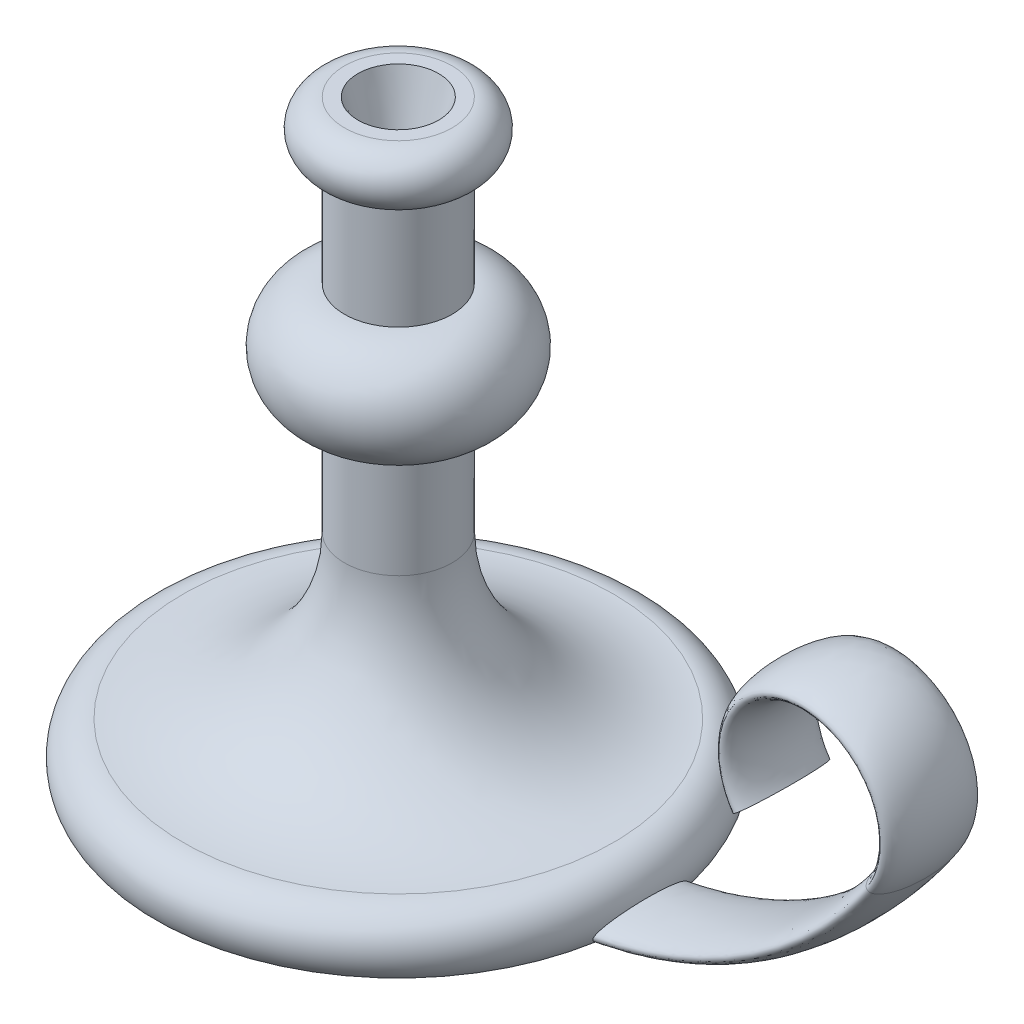
ISO-10303-21;
HEADER;
FILE_DESCRIPTION(('STEP AP214'),'2;1');
FILE_NAME('part.step','',(''),(''),'','','');
FILE_SCHEMA(('AUTOMOTIVE_DESIGN { 1 0 10303 214 1 1 1 1 }'));
ENDSEC;
DATA;
#1=APPLICATION_CONTEXT('core data for automotive mechanical design processes');
#2=APPLICATION_PROTOCOL_DEFINITION('international standard','automotive_design',2000,#1);
#3=PRODUCT_CONTEXT('',#1,'mechanical');
#4=PRODUCT('Part','Part','',(#3));
#5=PRODUCT_RELATED_PRODUCT_CATEGORY('part','',(#4));
#6=PRODUCT_DEFINITION_FORMATION('','',#4);
#7=PRODUCT_DEFINITION_CONTEXT('part definition',#1,'design');
#8=PRODUCT_DEFINITION('design','',#6,#7);
#9=PRODUCT_DEFINITION_SHAPE('','',#8);
#10=(LENGTH_UNIT() NAMED_UNIT(*) SI_UNIT(.MILLI.,.METRE.));
#11=(NAMED_UNIT(*) PLANE_ANGLE_UNIT() SI_UNIT($,.RADIAN.));
#12=(NAMED_UNIT(*) SI_UNIT($,.STERADIAN.) SOLID_ANGLE_UNIT());
#13=UNCERTAINTY_MEASURE_WITH_UNIT(LENGTH_MEASURE(1.E-05),#10,'distance_accuracy_value','');
#14=(GEOMETRIC_REPRESENTATION_CONTEXT(3) GLOBAL_UNCERTAINTY_ASSIGNED_CONTEXT((#13)) GLOBAL_UNIT_ASSIGNED_CONTEXT((#10,
#11,#12)) REPRESENTATION_CONTEXT('',''));
#15=CARTESIAN_POINT('',(0.,0.,0.));
#16=DIRECTION('',(0.,0.,1.));
#17=DIRECTION('',(1.,0.,0.));
#18=AXIS2_PLACEMENT_3D('',#15,#16,#17);
#19=CARTESIAN_POINT('',(0.,0.,0.));
#20=DIRECTION('',(0.,-1.,0.));
#21=DIRECTION('',(0.,0.,-1.));
#22=AXIS2_PLACEMENT_3D('',#19,#20,#21);
#23=PLANE('',#22);
#24=CARTESIAN_POINT('',(91.08,0.,14.0243685965194));
#25=CARTESIAN_POINT('',(90.8343618028383,0.,14.1467301561436));
#26=CARTESIAN_POINT('',(90.5863987118136,0.,14.2643727484616));
#27=CARTESIAN_POINT('',(90.0868821712373,0.,14.490369333805));
#28=CARTESIAN_POINT('',(89.8353370992757,0.,14.598741826816));
#29=CARTESIAN_POINT('',(89.3290061450993,0.,14.8067219167299));
#30=CARTESIAN_POINT('',(89.0742244400516,0.,14.9063397114357));
#31=CARTESIAN_POINT('',(88.5617434138045,0.,15.0973136618848));
#32=CARTESIAN_POINT('',(88.3040457195148,0.,15.188674191348));
#33=CARTESIAN_POINT('',(87.7860495114561,0.,15.3636097728107));
#34=CARTESIAN_POINT('',(87.5257512035921,0.,15.4471854358559));
#35=CARTESIAN_POINT('',(87.0051010500615,0.,15.606322930003));
#36=CARTESIAN_POINT('',(86.7447678594588,0.,15.6819459387066));
#37=CARTESIAN_POINT('',(86.2221447518362,0.,15.8264139162261));
#38=CARTESIAN_POINT('',(85.9598542523005,0.,15.8952567729754));
#39=CARTESIAN_POINT('',(85.4336152758858,0.,16.0265744533514));
#40=CARTESIAN_POINT('',(85.1696663834422,0.,16.0890476072845));
#41=CARTESIAN_POINT('',(84.640404995568,0.,16.2080239172415));
#42=CARTESIAN_POINT('',(84.375092383821,0.,16.2645265548519));
#43=CARTESIAN_POINT('',(83.8434000949704,0.,16.3719453309084));
#44=CARTESIAN_POINT('',(83.5770206412082,0.,16.4228625811495));
#45=CARTESIAN_POINT('',(82.680277179482,0.,16.5852717065964));
#46=CARTESIAN_POINT('',(82.0477486861757,0.,16.6849341510977));
#47=CARTESIAN_POINT('',(80.7795307570132,0.,16.8602175783787));
#48=CARTESIAN_POINT('',(80.1438416454728,0.,16.9358409781629));
#49=CARTESIAN_POINT('',(78.8699134936466,0.,17.0674520240191));
#50=CARTESIAN_POINT('',(78.2316727278448,0.,17.1234226902952));
#51=CARTESIAN_POINT('',(76.9532679423007,0.,17.21954367217));
#52=CARTESIAN_POINT('',(76.3131025363904,0.,17.2596750303836));
#53=CARTESIAN_POINT('',(75.0314249095192,0.,17.3274503545307));
#54=CARTESIAN_POINT('',(74.3899119816577,0.,17.3550805366317));
#55=CARTESIAN_POINT('',(73.1060888230193,0.,17.4007592501054));
#56=CARTESIAN_POINT('',(72.4637783523447,0.,17.41880075358));
#57=CARTESIAN_POINT('',(71.162163306799,0.,17.4481911735692));
#58=CARTESIAN_POINT('',(70.5028547124477,0.,17.4593522140255));
#59=CARTESIAN_POINT('',(69.1844526420683,0.,17.4765267342326));
#60=CARTESIAN_POINT('',(68.5253591918084,0.,17.4825423711941));
#61=CARTESIAN_POINT('',(67.2079945415874,0.,17.4912998302451));
#62=CARTESIAN_POINT('',(66.5497233659385,0.,17.4940458213816));
#63=CARTESIAN_POINT('',(65.2346101273432,0.,17.4977193436539));
#64=CARTESIAN_POINT('',(64.5777680729654,0.,17.4986508205422));
#65=CARTESIAN_POINT('',(63.2661188034309,0.,17.4997322793531));
#66=CARTESIAN_POINT('',(62.6113115893223,0.,17.4998846737388));
#67=CARTESIAN_POINT('',(61.6304203077991,0.,17.4999824124757));
#68=CARTESIAN_POINT('',(61.304336234128,0.,17.4999932927676));
#69=CARTESIAN_POINT('',(60.6521681077836,0.,17.5000004469593));
#70=CARTESIAN_POINT('',(60.3260840551103,0.,17.4999967208601));
#71=CARTESIAN_POINT('',(60.,0.,17.5));
#72=B_SPLINE_CURVE_WITH_KNOTS('',3,(#24,#25,#26,#27,#28,#29,#30,#31,#32,#33,#34,#35,#36,#37,#38,
#39,#40,#41,#42,#43,#44,#45,#46,#47,#48,#49,#50,#51,#52,#53,#54,#55,#56,#57,#58,#59,#60,#61,#62,
#63,#64,#65,#66,#67,#68,#69,#70,#71),.UNSPECIFIED.,.F.,.F.,(4,2,2,2,2,2,2,2,2,2,2,2,2,2,2,2,2,2,
2,2,2,2,2,4),(0.,0.823198563414463,1.64471398633303,2.46525942986521,3.28536766687318,
4.10541147802373,4.91859686766643,5.73203477453971,6.54568536307928,7.35940654208314,
8.17296545138196,10.0933232761845,12.0134879575909,13.935307586311,15.8594204332903,
17.7856496731296,19.7132887776188,21.6914688391538,23.6688191415248,25.6436454628567,
27.6141726100984,29.5785942218169,30.5568464462069,31.5350986064819),.UNSPECIFIED.);
#73=CARTESIAN_POINT('',(88.7357277043992,0.,15.0323194740772));
#74=VERTEX_POINT('',#73);
#75=CARTESIAN_POINT('',(60.,0.,17.5));
#76=VERTEX_POINT('',#75);
#77=EDGE_CURVE('E75',#74,#76,#72,.T.);
#78=ORIENTED_EDGE('',*,*,#77,.F.);
#79=CARTESIAN_POINT('',(0.,0.,0.));
#80=DIRECTION('',(0.,-1.,0.));
#81=DIRECTION('',(0.,0.,-1.));
#82=AXIS2_PLACEMENT_3D('',#79,#80,#81);
#83=CIRCLE('',#82,90.);
#84=CARTESIAN_POINT('',(88.7357277043991,0.,-15.0323194740775));
#85=VERTEX_POINT('',#84);
#86=EDGE_CURVE('E68',#74,#85,#83,.T.);
#87=ORIENTED_EDGE('',*,*,#86,.T.);
#88=CARTESIAN_POINT('',(60.0000000000001,0.,-17.5));
#89=CARTESIAN_POINT('',(60.4764790286551,0.,-17.4999849699017));
#90=CARTESIAN_POINT('',(60.9529580487085,0.,-17.5000019946367));
#91=CARTESIAN_POINT('',(61.9053389971228,0.,-17.4999694859082));
#92=CARTESIAN_POINT('',(62.38124092549,0.,-17.4999200330315));
#93=CARTESIAN_POINT('',(63.8080190300425,0.,-17.4994770174264));
#94=CARTESIAN_POINT('',(64.7588952160596,0.,-17.4987892758948));
#95=CARTESIAN_POINT('',(66.6606634256278,0.,-17.4939489283379));
#96=CARTESIAN_POINT('',(67.6115554490938,0.,-17.4897962497932));
#97=CARTESIAN_POINT('',(69.5165393927652,0.,-17.4734653053257));
#98=CARTESIAN_POINT('',(70.4706311219005,0.,-17.4612596097535));
#99=CARTESIAN_POINT('',(72.3785164499177,0.,-17.4223879279371));
#100=CARTESIAN_POINT('',(73.3323100614798,0.,-17.3957226761189));
#101=CARTESIAN_POINT('',(75.0537734110783,0.,-17.3269416623314));
#102=CARTESIAN_POINT('',(75.821595472817,0.,-17.2888350982801));
#103=CARTESIAN_POINT('',(77.3560984595798,0.,-17.1924025053128));
#104=CARTESIAN_POINT('',(78.1227792629428,0.,-17.1340744568722));
#105=CARTESIAN_POINT('',(79.654296439769,0.,-16.9908527116412));
#106=CARTESIAN_POINT('',(80.4191310638966,0.,-16.9059397036283));
#107=CARTESIAN_POINT('',(81.93851747462,0.,-16.7030102240737));
#108=CARTESIAN_POINT('',(82.6931030663994,0.,-16.5852542681211));
#109=CARTESIAN_POINT('',(84.1942994047661,0.,-16.3083141804734));
#110=CARTESIAN_POINT('',(84.9409146485175,0.,-16.1491548534721));
#111=CARTESIAN_POINT('',(86.4209388304942,0.,-15.7805576661685));
#112=CARTESIAN_POINT('',(87.1543644915969,0.,-15.5711891296269));
#113=CARTESIAN_POINT('',(88.1510457262815,0.,-15.2416929836298));
#114=CARTESIAN_POINT('',(88.422852517135,0.,-15.1471145702862));
#115=CARTESIAN_POINT('',(88.9631621862974,0.,-14.9489466165185));
#116=CARTESIAN_POINT('',(89.2316652446759,0.,-14.845357569724));
#117=CARTESIAN_POINT('',(89.7661506052318,0.,-14.6281477829023));
#118=CARTESIAN_POINT('',(90.0321136983802,0.,-14.5144796598446));
#119=CARTESIAN_POINT('',(90.5595784056357,0.,-14.277080382856));
#120=CARTESIAN_POINT('',(90.8210789886349,0.,-14.1533469403213));
#121=CARTESIAN_POINT('',(91.08,0.,-14.0243685965194));
#122=B_SPLINE_CURVE_WITH_KNOTS('',3,(#88,#89,#90,#91,#92,#93,#94,#95,#96,#97,#98,#99,#100,#101,
#102,#103,#104,#105,#106,#107,#108,#109,#110,#111,#112,#113,#114,#115,#116,#117,#118,#119,#120,
#121),.UNSPECIFIED.,.F.,.F.,(4,2,2,2,2,2,2,2,2,2,2,2,2,2,2,2,4),(0.,1.42943706618285,
2.85714287317236,5.7097714159088,8.56245966422,11.4249150616417,14.2872250836136,
16.5933345837201,18.8996744619326,21.2076935596745,23.4979017133306,25.7867409541743,
28.072438011434,28.9356879891631,29.7988907052187,30.6663916191198,31.5340903354968),.UNSPECIFIED.);
#123=CARTESIAN_POINT('',(60.0000000000001,0.,-17.5));
#124=VERTEX_POINT('',#123);
#125=EDGE_CURVE('E80',#124,#85,#122,.T.);
#126=ORIENTED_EDGE('',*,*,#125,.F.);
#127=DIRECTION('',(1.,0.,0.));
#128=VECTOR('',#127,1.);
#129=CARTESIAN_POINT('',(30.,0.,-17.5));
#130=LINE('',#129,#128);
#131=CARTESIAN_POINT('',(0.,0.,-17.5));
#132=VERTEX_POINT('',#131);
#133=EDGE_CURVE('E83',#132,#124,#130,.T.);
#134=ORIENTED_EDGE('',*,*,#133,.F.);
#135=DIRECTION('',(0.,0.,1.));
#136=VECTOR('',#135,1.);
#137=CARTESIAN_POINT('',(0.,0.,0.));
#138=LINE('',#137,#136);
#139=CARTESIAN_POINT('',(0.,0.,17.5));
#140=VERTEX_POINT('',#139);
#141=EDGE_CURVE('E46',#132,#140,#138,.T.);
#142=ORIENTED_EDGE('',*,*,#141,.T.);
#143=DIRECTION('',(1.,0.,0.));
#144=VECTOR('',#143,1.);
#145=CARTESIAN_POINT('',(30.,0.,17.5));
#146=LINE('',#145,#144);
#147=EDGE_CURVE('E11',#76,#140,#146,.F.);
#148=ORIENTED_EDGE('',*,*,#147,.F.);
#149=EDGE_LOOP('',(#78,#87,#126,#134,#142,#148));
#150=FACE_BOUND('',#149,.T.);
#151=ADVANCED_FACE('F38',(#150),#23,.T.);
#152=CARTESIAN_POINT('',(0.,220.,0.));
#153=DIRECTION('',(0.,1.,0.));
#154=DIRECTION('',(0.,0.,1.));
#155=AXIS2_PLACEMENT_3D('',#152,#153,#154);
#156=PLANE('',#155);
#157=CARTESIAN_POINT('',(0.,220.,0.));
#158=DIRECTION('',(0.,1.,0.));
#159=DIRECTION('',(0.,0.,1.));
#160=AXIS2_PLACEMENT_3D('',#157,#158,#159);
#161=CIRCLE('',#160,15.);
#162=CARTESIAN_POINT('',(0.,220.,15.));
#163=VERTEX_POINT('',#162);
#164=EDGE_CURVE('E207',#163,#163,#161,.T.);
#165=ORIENTED_EDGE('',*,*,#164,.F.);
#166=EDGE_LOOP('',(#165));
#167=FACE_BOUND('',#166,.T.);
#168=CARTESIAN_POINT('',(0.,220.,0.));
#169=DIRECTION('',(0.,-1.,0.));
#170=DIRECTION('',(0.,0.,-1.));
#171=AXIS2_PLACEMENT_3D('',#168,#169,#170);
#172=CIRCLE('',#171,20.);
#173=CARTESIAN_POINT('',(0.,220.,-20.));
#174=VERTEX_POINT('',#173);
#175=EDGE_CURVE('E84',#174,#174,#172,.T.);
#176=ORIENTED_EDGE('',*,*,#175,.F.);
#177=EDGE_LOOP('',(#176));
#178=FACE_BOUND('',#177,.T.);
#179=ADVANCED_FACE('F154',(#167,#178),#156,.T.);
#180=CARTESIAN_POINT('',(0.,210.,0.));
#181=DIRECTION('',(0.,-1.,0.));
#182=DIRECTION('',(0.,0.,-1.));
#183=AXIS2_PLACEMENT_3D('',#180,#181,#182);
#184=TOROIDAL_SURFACE('',#183,20.,9.99999999999999);
#185=ORIENTED_EDGE('',*,*,#175,.T.);
#186=EDGE_LOOP('',(#185));
#187=FACE_BOUND('',#186,.T.);
#188=CARTESIAN_POINT('',(0.,200.,0.));
#189=DIRECTION('',(0.,-1.,0.));
#190=DIRECTION('',(0.,0.,-1.));
#191=AXIS2_PLACEMENT_3D('',#188,#189,#190);
#192=CIRCLE('',#191,20.);
#193=CARTESIAN_POINT('',(0.,200.,-20.));
#194=VERTEX_POINT('',#193);
#195=EDGE_CURVE('E89',#194,#194,#192,.T.);
#196=ORIENTED_EDGE('',*,*,#195,.F.);
#197=EDGE_LOOP('',(#196));
#198=FACE_BOUND('',#197,.T.);
#199=ADVANCED_FACE('F152',(#187,#198),#184,.T.);
#200=CARTESIAN_POINT('',(0.,0.,0.));
#201=DIRECTION('',(0.,-1.,0.));
#202=DIRECTION('',(0.,0.,-1.));
#203=AXIS2_PLACEMENT_3D('',#200,#201,#202);
#204=CYLINDRICAL_SURFACE('',#203,20.);
#205=ORIENTED_EDGE('',*,*,#195,.T.);
#206=EDGE_LOOP('',(#205));
#207=FACE_BOUND('',#206,.T.);
#208=CARTESIAN_POINT('',(0.,160.,0.));
#209=DIRECTION('',(0.,-1.,0.));
#210=DIRECTION('',(0.,0.,-1.));
#211=AXIS2_PLACEMENT_3D('',#208,#209,#210);
#212=CIRCLE('',#211,20.);
#213=CARTESIAN_POINT('',(0.,160.,-20.));
#214=VERTEX_POINT('',#213);
#215=EDGE_CURVE('E144',#214,#214,#212,.T.);
#216=ORIENTED_EDGE('',*,*,#215,.F.);
#217=EDGE_LOOP('',(#216));
#218=FACE_BOUND('',#217,.T.);
#219=ADVANCED_FACE('F149',(#207,#218),#204,.T.);
#220=CARTESIAN_POINT('',(0.,140.,0.));
#221=DIRECTION('',(0.,-1.,0.));
#222=DIRECTION('',(0.,0.,-1.));
#223=AXIS2_PLACEMENT_3D('',#220,#221,#222);
#224=TOROIDAL_SURFACE('',#223,20.,20.);
#225=ORIENTED_EDGE('',*,*,#215,.T.);
#226=EDGE_LOOP('',(#225));
#227=FACE_BOUND('',#226,.T.);
#228=CARTESIAN_POINT('',(0.,120.,0.));
#229=DIRECTION('',(0.,-1.,0.));
#230=DIRECTION('',(0.,0.,-1.));
#231=AXIS2_PLACEMENT_3D('',#228,#229,#230);
#232=CIRCLE('',#231,20.);
#233=CARTESIAN_POINT('',(0.,120.,-20.));
#234=VERTEX_POINT('',#233);
#235=EDGE_CURVE('E141',#234,#234,#232,.T.);
#236=ORIENTED_EDGE('',*,*,#235,.F.);
#237=EDGE_LOOP('',(#236));
#238=FACE_BOUND('',#237,.T.);
#239=ADVANCED_FACE('F161',(#227,#238),#224,.T.);
#240=CARTESIAN_POINT('',(0.,0.,0.));
#241=DIRECTION('',(0.,-1.,0.));
#242=DIRECTION('',(0.,0.,-1.));
#243=AXIS2_PLACEMENT_3D('',#240,#241,#242);
#244=CYLINDRICAL_SURFACE('',#243,20.);
#245=ORIENTED_EDGE('',*,*,#235,.T.);
#246=EDGE_LOOP('',(#245));
#247=FACE_BOUND('',#246,.T.);
#248=CARTESIAN_POINT('',(0.,80.,0.));
#249=DIRECTION('',(0.,-1.,0.));
#250=DIRECTION('',(0.,0.,-1.));
#251=AXIS2_PLACEMENT_3D('',#248,#249,#250);
#252=CIRCLE('',#251,20.);
#253=CARTESIAN_POINT('',(0.,80.,-20.));
#254=VERTEX_POINT('',#253);
#255=EDGE_CURVE('E138',#254,#254,#252,.T.);
#256=ORIENTED_EDGE('',*,*,#255,.F.);
#257=EDGE_LOOP('',(#256));
#258=FACE_BOUND('',#257,.T.);
#259=ADVANCED_FACE('F231',(#247,#258),#244,.T.);
#260=CARTESIAN_POINT('',(0.,80.,0.));
#261=DIRECTION('',(0.,-1.,0.));
#262=DIRECTION('',(0.,0.,-1.));
#263=AXIS2_PLACEMENT_3D('',#260,#261,#262);
#264=TOROIDAL_SURFACE('',#263,80.,60.);
#265=ORIENTED_EDGE('',*,*,#255,.T.);
#266=EDGE_LOOP('',(#265));
#267=FACE_BOUND('',#266,.T.);
#268=CARTESIAN_POINT('',(0.,20.,0.));
#269=DIRECTION('',(0.,-1.,0.));
#270=DIRECTION('',(0.,0.,-1.));
#271=AXIS2_PLACEMENT_3D('',#268,#269,#270);
#272=CIRCLE('',#271,80.0000000000001);
#273=CARTESIAN_POINT('',(0.,20.,-80.0000000000001));
#274=VERTEX_POINT('',#273);
#275=EDGE_CURVE('E74',#274,#274,#272,.T.);
#276=ORIENTED_EDGE('',*,*,#275,.F.);
#277=EDGE_LOOP('',(#276));
#278=FACE_BOUND('',#277,.T.);
#279=ADVANCED_FACE('F226',(#267,#278),#264,.F.);
#280=CARTESIAN_POINT('',(0.,7.50000000000004,0.));
#281=DIRECTION('',(0.,-1.,0.));
#282=DIRECTION('',(0.,0.,-1.));
#283=AXIS2_PLACEMENT_3D('',#280,#281,#282);
#284=TOROIDAL_SURFACE('',#283,80.0000000000001,12.5);
#285=CARTESIAN_POINT('',(88.7357277043991,0.,-15.0323194740775));
#286=CARTESIAN_POINT('',(88.7568853051407,0.0480461934314739,-15.1231463312808));
#287=CARTESIAN_POINT('',(88.7784371606674,0.0973244863855045,-15.2132457565229));
#288=CARTESIAN_POINT('',(88.8225089178798,0.198775163856787,-15.3919693431005));
#289=CARTESIAN_POINT('',(88.8450317901081,0.25095659549155,-15.4805876280639));
#290=CARTESIAN_POINT('',(88.891114722421,0.358394739738755,-15.6558303790269));
#291=CARTESIAN_POINT('',(88.9146760260036,0.413655161499713,-15.7424522544315));
#292=CARTESIAN_POINT('',(88.9634077457109,0.528607972961005,-15.9148116457832));
#293=CARTESIAN_POINT('',(88.9886004647536,0.588365392588335,-16.0004996861712));
#294=CARTESIAN_POINT('',(89.0403060675197,0.711653367337253,-16.1685777375201));
#295=CARTESIAN_POINT('',(89.0668175945105,0.775180057258789,-16.250970986763));
#296=CARTESIAN_POINT('',(89.1213455087281,0.906428412279315,-16.4117382492734));
#297=CARTESIAN_POINT('',(89.1493607126046,0.974146784894771,-16.4901153308817));
#298=CARTESIAN_POINT('',(89.2001867637326,1.09745777114807,-16.6237166914776));
#299=CARTESIAN_POINT('',(89.222634502357,1.1520637504067,-16.6799857928146));
#300=CARTESIAN_POINT('',(89.2686119585798,1.26416073892383,-16.7891006999368));
#301=CARTESIAN_POINT('',(89.2921417876948,1.32165204559086,-16.8419461515338));
#302=CARTESIAN_POINT('',(89.364304511551,1.49827675976182,-16.9939866724894));
#303=CARTESIAN_POINT('',(89.4147055324283,1.6220343924803,-17.0872134923983));
#304=CARTESIAN_POINT('',(89.5111110074776,1.85900047742431,-17.2358931747898));
#305=CARTESIAN_POINT('',(89.5562851357663,1.97012594803072,-17.2951212692136));
#306=CARTESIAN_POINT('',(89.6263679449451,2.14235052028055,-17.3686622397182));
#307=CARTESIAN_POINT('',(89.650118256714,2.20068742204993,-17.3906271026735));
#308=CARTESIAN_POINT('',(89.6982927604284,2.3189037914928,-17.4288992093079));
#309=CARTESIAN_POINT('',(89.7227166149649,2.37878248584824,-17.4452092321148));
#310=CARTESIAN_POINT('',(89.7723348463451,2.50026151663348,-17.4718254764637));
#311=CARTESIAN_POINT('',(89.7975343966793,2.56187291421872,-17.4820719804923));
#312=CARTESIAN_POINT('',(89.8482716460667,2.68570080191658,-17.4959856751506));
#313=CARTESIAN_POINT('',(89.8738093416075,2.74791728574247,-17.4996529340639));
#314=CARTESIAN_POINT('',(89.924992407073,2.87234672935962,-17.5002998289493));
#315=CARTESIAN_POINT('',(89.9506377818952,2.93455968885724,-17.497279157372));
#316=CARTESIAN_POINT('',(90.0017912070334,3.05835418125918,-17.4846982300693));
#317=CARTESIAN_POINT('',(90.0272992628939,3.11993573974957,-17.4751382404064));
#318=CARTESIAN_POINT('',(90.0963148159789,3.28611417415257,-17.4406325315858));
#319=CARTESIAN_POINT('',(90.1394997440064,3.38961489408774,-17.4095600184341));
#320=CARTESIAN_POINT('',(90.224007176405,3.59117142235289,-17.3317477745918));
#321=CARTESIAN_POINT('',(90.2653289951596,3.68922522927243,-17.285002328858));
#322=CARTESIAN_POINT('',(90.373139482952,3.94378989478678,-17.1428597084404));
#323=CARTESIAN_POINT('',(90.4376495559872,4.09474804628463,-17.0359871709696));
#324=CARTESIAN_POINT('',(90.5296252593686,4.3083032947609,-16.8582523597775));
#325=CARTESIAN_POINT('',(90.5595410973505,4.37746786569,-16.7959596392969));
#326=CARTESIAN_POINT('',(90.6178799017324,4.51182477438934,-16.6665617483202));
#327=CARTESIAN_POINT('',(90.6463031708551,4.57701791807672,-16.5994575602672));
#328=CARTESIAN_POINT('',(90.7272233879073,4.76193461559264,-16.3979020468603));
#329=CARTESIAN_POINT('',(90.777853284754,4.87674546193808,-16.2582036171726));
#330=CARTESIAN_POINT('',(90.8747230928564,5.09502800174027,-15.9687484239197));
#331=CARTESIAN_POINT('',(90.9209586799314,5.19848854116264,-15.8189819954047));
#332=CARTESIAN_POINT('',(91.009720180223,5.3959694455974,-15.5118868058277));
#333=CARTESIAN_POINT('',(91.0522382127212,5.48996981707819,-15.3545430261036));
#334=CARTESIAN_POINT('',(91.1339471864284,5.66967371769768,-15.0344787957027));
#335=CARTESIAN_POINT('',(91.1731394056457,5.75538043562703,-14.8717604440085));
#336=CARTESIAN_POINT('',(91.248472563007,5.91934346708998,-14.5427677939222));
#337=CARTESIAN_POINT('',(91.2846247496555,5.99762739681619,-14.3765097414399));
#338=CARTESIAN_POINT('',(91.3543683528294,6.14800572275806,-14.040673654477));
#339=CARTESIAN_POINT('',(91.3879593642089,6.22009913993871,-13.8710951000448));
#340=CARTESIAN_POINT('',(91.452877427764,6.35888755490117,-13.5290212836307));
#341=CARTESIAN_POINT('',(91.4842010271485,6.42557433730969,-13.3565220472219));
#342=CARTESIAN_POINT('',(91.5447363006842,6.55399704532447,-13.0093180898463));
#343=CARTESIAN_POINT('',(91.5739477951079,6.61573254965542,-12.8346131826725));
#344=CARTESIAN_POINT('',(91.6587116063939,6.79430286485649,-12.307535080574));
#345=CARTESIAN_POINT('',(91.7113546098898,6.90441912835498,-11.9524053857721));
#346=CARTESIAN_POINT('',(91.8101392029384,7.11001004451964,-11.2353263649321));
#347=CARTESIAN_POINT('',(91.8562499413987,7.20541539519804,-10.873353269472));
#348=CARTESIAN_POINT('',(91.9423868588638,7.3828900261236,-10.145847313811));
#349=CARTESIAN_POINT('',(91.9824191325825,7.46497267046439,-9.7803184156049));
#350=CARTESIAN_POINT('',(92.0569953779133,7.61735908368768,-9.04635801768006));
#351=CARTESIAN_POINT('',(92.0915404821266,7.68766528349839,-8.67792713347906));
#352=CARTESIAN_POINT('',(92.1574115047356,7.82135067846046,-7.9174565714154));
#353=CARTESIAN_POINT('',(92.1884371028955,7.88409702881709,-7.52528013253328));
#354=CARTESIAN_POINT('',(92.2451955590846,7.99861735952374,-6.73892756473105));
#355=CARTESIAN_POINT('',(92.2709280008001,8.05039047682459,-6.34475128101699));
#356=CARTESIAN_POINT('',(92.3173983664597,8.14371875872639,-5.55453110884762));
#357=CARTESIAN_POINT('',(92.3381316539661,8.18526443869059,-5.15848583136918));
#358=CARTESIAN_POINT('',(92.3747804697417,8.25860206606328,-4.36526324043184));
#359=CARTESIAN_POINT('',(92.3906957443758,8.29039349997934,-3.9680858684866));
#360=CARTESIAN_POINT('',(92.4314699652309,8.37177142275003,-2.77489148142149));
#361=CARTESIAN_POINT('',(92.4493328536656,8.40731260818474,-1.97763494410002));
#362=CARTESIAN_POINT('',(92.4670652858997,8.4425967735793,-0.382792506304883));
#363=CARTESIAN_POINT('',(92.466949270676,8.44236848421941,0.414792615267919));
#364=CARTESIAN_POINT('',(92.4532925100551,8.41519024623936,1.61007638791835));
#365=CARTESIAN_POINT('',(92.4464971871515,8.40166626741197,2.00820286633645));
#366=CARTESIAN_POINT('',(92.4283488447979,8.36551321221103,2.80393208525387));
#367=CARTESIAN_POINT('',(92.4169960147842,8.34288451428194,3.2015348468328));
#368=CARTESIAN_POINT('',(92.3896388965394,8.2882838079655,3.99570602938688));
#369=CARTESIAN_POINT('',(92.3736373194304,8.25631724530669,4.39227491768635));
#370=CARTESIAN_POINT('',(92.33682828906,8.18265334354996,5.18426889383482));
#371=CARTESIAN_POINT('',(92.3160210877476,8.14095651458866,5.57969404054777));
#372=CARTESIAN_POINT('',(92.2697135236077,8.04794740306418,6.36357374479135));
#373=CARTESIAN_POINT('',(92.2442821015407,7.99677618905994,6.7520490319131));
#374=CARTESIAN_POINT('',(92.188271491679,7.88376094342984,7.527099311447));
#375=CARTESIAN_POINT('',(92.1576920689495,7.82191642471244,7.91367421630403));
#376=CARTESIAN_POINT('',(92.0910196057648,7.68661174094691,8.68447111406416));
#377=CARTESIAN_POINT('',(92.05492450531,7.61314723569577,9.06869217185467));
#378=CARTESIAN_POINT('',(91.9769323311136,7.45373942323028,9.8321693459991));
#379=CARTESIAN_POINT('',(91.9350617329103,7.36785297703665,10.2114399331276));
#380=CARTESIAN_POINT('',(91.8447878452935,7.18173068298183,10.965564328586));
#381=CARTESIAN_POINT('',(91.7963864171407,7.08149892298628,11.3404193623562));
#382=CARTESIAN_POINT('',(91.692220364902,6.86444342633838,12.0840622774153));
#383=CARTESIAN_POINT('',(91.6364610012564,6.74763153891705,12.4528542835035));
#384=CARTESIAN_POINT('',(91.5539658004673,6.57348573995714,12.9536475116274));
#385=CARTESIAN_POINT('',(91.5309291994563,6.52473099719962,13.0892641208881));
#386=CARTESIAN_POINT('',(91.4835662982148,6.42419365572743,13.3591355074921));
#387=CARTESIAN_POINT('',(91.4592400334788,6.37241114033987,13.4933903221939));
#388=CARTESIAN_POINT('',(91.38409300375,6.21194063366556,13.8943244982569));
#389=CARTESIAN_POINT('',(91.3311835615011,6.09829721983173,14.158685172684));
#390=CARTESIAN_POINT('',(91.2384862897907,5.89766021951068,14.5875949682975));
#391=CARTESIAN_POINT('',(91.2005849383174,5.81525528191925,14.7547023765883));
#392=CARTESIAN_POINT('',(91.1216305293265,5.64265719245884,15.0841889384543));
#393=CARTESIAN_POINT('',(91.0805765028495,5.55246164511267,15.2465666170496));
#394=CARTESIAN_POINT('',(90.9949562048517,5.36321601250151,15.564694773857));
#395=CARTESIAN_POINT('',(90.9503973901268,5.2641846690136,15.7204582916393));
#396=CARTESIAN_POINT('',(90.8571539902035,5.05556324848933,16.0233394712194));
#397=CARTESIAN_POINT('',(90.8084727216355,4.94598164989188,16.1704639249964));
#398=CARTESIAN_POINT('',(90.7091750340933,4.72080341543916,16.4446374171896));
#399=CARTESIAN_POINT('',(90.6588317079176,4.60591709624268,16.5723547236845));
#400=CARTESIAN_POINT('',(90.5796162434983,4.42376585319341,16.7524056367367));
#401=CARTESIAN_POINT('',(90.5525897697903,4.36140115735284,16.8105100548153));
#402=CARTESIAN_POINT('',(90.4972389377675,4.23318645694775,16.9220498115015));
#403=CARTESIAN_POINT('',(90.4689146153065,4.16733654865607,16.9754852789726));
#404=CARTESIAN_POINT('',(90.3913780869785,3.9863606657584,17.1108105689002));
#405=CARTESIAN_POINT('',(90.3409172388679,3.86785155694935,17.1876981719997));
#406=CARTESIAN_POINT('',(90.2626021778662,3.68267126768087,17.2867416022796));
#407=CARTESIAN_POINT('',(90.2360705511234,3.6197339913857,17.3170329068101));
#408=CARTESIAN_POINT('',(90.1822177046599,3.49156821581747,17.3713927486981));
#409=CARTESIAN_POINT('',(90.1548970557927,3.42634136602613,17.3954656655501));
#410=CARTESIAN_POINT('',(90.1053970783921,3.30779050530204,17.4323091044336));
#411=CARTESIAN_POINT('',(90.0833345773514,3.25482300858624,17.4463898939655));
#412=CARTESIAN_POINT('',(90.0389374978142,3.14798390842936,17.4698178878208));
#413=CARTESIAN_POINT('',(90.0166030565984,3.09411275637383,17.4791673867672));
#414=CARTESIAN_POINT('',(89.9718026881184,2.98581730163852,17.4928781779584));
#415=CARTESIAN_POINT('',(89.9493368221546,2.93139324928662,17.4972416342664));
#416=CARTESIAN_POINT('',(89.9044198379745,2.8223668689242,17.5008495871255));
#417=CARTESIAN_POINT('',(89.8819687200755,2.76776453721904,17.5000939769077));
#418=CARTESIAN_POINT('',(89.8372431310621,2.65880358661037,17.4934635198058));
#419=CARTESIAN_POINT('',(89.8149686453279,2.6044449477019,17.4875891011614));
#420=CARTESIAN_POINT('',(89.7707397167983,2.49635614094498,17.4708697187046));
#421=CARTESIAN_POINT('',(89.7487853911754,2.44262620454425,17.4600229799983));
#422=CARTESIAN_POINT('',(89.6835948667894,2.28290674207255,17.4203861383411));
#423=CARTESIAN_POINT('',(89.6410219567928,2.17836520696052,17.3844978922607));
#424=CARTESIAN_POINT('',(89.542763883849,1.93689319814421,17.2802552615421));
#425=CARTESIAN_POINT('',(89.4881934684648,1.80262813975463,17.2047598538544));
#426=CARTESIAN_POINT('',(89.4101502971485,1.61088197851763,17.0753167013484));
#427=CARTESIAN_POINT('',(89.3847305227579,1.54847526978139,17.0293750708836));
#428=CARTESIAN_POINT('',(89.3350967220068,1.42677863029747,16.932929887122));
#429=CARTESIAN_POINT('',(89.3108825363203,1.36748828764496,16.8824269391269));
#430=CARTESIAN_POINT('',(89.245508458148,1.20771229501002,16.7375643038878));
#431=CARTESIAN_POINT('',(89.2055439484095,1.11038111533273,16.6391900254418));
#432=CARTESIAN_POINT('',(89.128640591952,0.923975924778655,16.4337866729707));
#433=CARTESIAN_POINT('',(89.0917044717895,0.834909345487065,16.3267499684582));
#434=CARTESIAN_POINT('',(89.0203533730348,0.663897894973373,16.1060710462301));
#435=CARTESIAN_POINT('',(88.9859428216037,0.581965484763375,15.9924178272111));
#436=CARTESIAN_POINT('',(88.9193216884821,0.424482928292589,15.7602597169413));
#437=CARTESIAN_POINT('',(88.8871101982861,0.348930143302652,15.6417568619988));
#438=CARTESIAN_POINT('',(88.8349971576719,0.227699044185128,15.4411915359592));
#439=CARTESIAN_POINT('',(88.8145794329051,0.180475408721505,15.3601867760988));
#440=CARTESIAN_POINT('',(88.7745769288591,0.088500829577704,15.197093805622));
#441=CARTESIAN_POINT('',(88.754988756913,0.0437395323878262,15.1150122735559));
#442=CARTESIAN_POINT('',(88.735727704399,-1.2001172183447E-13,15.0323194740773));
#443=B_SPLINE_CURVE_WITH_KNOTS('',3,(#285,#286,#287,#288,#289,#290,#291,#292,#293,#294,#295,
#296,#297,#298,#299,#300,#301,#302,#303,#304,#305,#306,#307,#308,#309,#310,#311,#312,#313,#314,
#315,#316,#317,#318,#319,#320,#321,#322,#323,#324,#325,#326,#327,#328,#329,#330,#331,#332,#333,
#334,#335,#336,#337,#338,#339,#340,#341,#342,#343,#344,#345,#346,#347,#348,#349,#350,#351,#352,
#353,#354,#355,#356,#357,#358,#359,#360,#361,#362,#363,#364,#365,#366,#367,#368,#369,#370,#371,
#372,#373,#374,#375,#376,#377,#378,#379,#380,#381,#382,#383,#384,#385,#386,#387,#388,#389,#390,
#391,#392,#393,#394,#395,#396,#397,#398,#399,#400,#401,#402,#403,#404,#405,#406,#407,#408,#409,
#410,#411,#412,#413,#414,#415,#416,#417,#418,#419,#420,#421,#422,#423,#424,#425,#426,#427,#428,
#429,#430,#431,#432,#433,#434,#435,#436,#437,#438,#439,#440,#441,#442),.UNSPECIFIED.,.F.,.F.,(4,
2,2,2,2,2,2,2,2,2,2,2,2,2,2,2,2,2,2,2,2,2,2,2,2,2,2,2,2,2,2,2,2,2,2,2,2,2,2,2,2,2,2,2,2,2,2,2,2,
2,2,2,2,2,2,2,2,2,2,2,2,2,2,2,2,2,2,2,2,2,2,2,2,2,2,2,2,2,4),(0.,0.314733123327164,
0.630508941455827,0.946673753018409,1.26895112988621,1.59090355496956,1.91260622531395,
2.15715967367937,2.40173838166113,2.88870383215622,3.28841644818296,3.4883119061179,
3.68810898370802,3.88984238682517,4.09157369620767,4.29331428254345,4.49504666123268,
4.84265680600318,5.19039384288546,5.77442212685127,6.06762217171306,6.36076251825578,
6.92314867234548,7.48608262854365,8.05018237441333,8.61406436302194,9.17575858202778,
9.73754147048416,10.3001625837436,10.8628315164725,11.9888463472025,13.1200135459827,
14.250038955649,15.3798308139218,16.5747430530495,17.7697492376567,18.9658594974197,
20.1620327131749,22.5556563132509,24.9473573220151,26.1424918409627,27.3375766883792,
28.531965963638,29.7262926337368,30.9040893972108,32.0819399253459,33.2602314380807,
34.4332907182326,35.6060163844786,36.7779081259989,37.2157015235236,37.6534828782341,
38.5306112912431,39.1008314906716,39.6712276513584,40.2404414599166,40.8092015932422,
41.3451924448759,41.613272789452,41.8813457326429,42.3295200627058,42.5534353172377,
42.7771924398016,42.9542567633889,43.1312351302621,43.308136655029,43.4850418694589,
43.6619322854172,43.8388858925035,44.192721413292,44.6800873888512,44.924620804879,
45.1691218180706,45.6005212829055,46.0323049802808,46.4648283331277,46.8971719010542,
47.1850207259608,47.4715484988519),.UNSPECIFIED.);
#444=EDGE_CURVE('E72',#85,#74,#443,.T.);
#445=ORIENTED_EDGE('',*,*,#444,.F.);
#446=ORIENTED_EDGE('',*,*,#86,.F.);
#447=EDGE_LOOP('',(#445,#446));
#448=FACE_BOUND('',#447,.T.);
#449=ORIENTED_EDGE('',*,*,#275,.T.);
#450=EDGE_LOOP('',(#449));
#451=FACE_BOUND('',#450,.T.);
#452=ADVANCED_FACE('F69',(#448,#451),#284,.T.);
#453=CARTESIAN_POINT('',(0.,0.,0.));
#454=DIRECTION('',(1.,0.,0.));
#455=DIRECTION('',(0.,0.,-1.));
#456=AXIS2_PLACEMENT_3D('',#453,#454,#455);
#457=PLANE('',#456);
#458=ORIENTED_EDGE('',*,*,#141,.F.);
#459=CARTESIAN_POINT('',(0.,0.,0.));
#460=DIRECTION('',(1.,0.,0.));
#461=DIRECTION('',(0.,0.,1.));
#462=AXIS2_PLACEMENT_3D('',#459,#460,#461);
#463=ELLIPSE('',#462,17.5,5.);
#464=EDGE_CURVE('E206',#140,#132,#463,.T.);
#465=ORIENTED_EDGE('',*,*,#464,.F.);
#466=EDGE_LOOP('',(#458,#465));
#467=FACE_BOUND('',#466,.T.);
#468=ADVANCED_FACE('F191',(#467),#457,.F.);
#469=CARTESIAN_POINT('',(142.394713962055,69.3333333333333,0.));
#470=DIRECTION('',(0.566666666666666,-0.823947139620552,0.));
#471=DIRECTION('',(0.,0.,-1.));
#472=AXIS2_PLACEMENT_3D('',#469,#470,#471);
#473=PLANE('',#472);
#474=CARTESIAN_POINT('',(142.394713962055,69.3333333333333,0.));
#475=DIRECTION('',(0.566666666666666,-0.823947139620552,0.));
#476=DIRECTION('',(0.,0.,1.));
#477=AXIS2_PLACEMENT_3D('',#474,#475,#476);
#478=ELLIPSE('',#477,17.5,5.);
#479=CARTESIAN_POINT('',(142.394713962055,69.3333333333333,17.5));
#480=VERTEX_POINT('',#479);
#481=EDGE_CURVE('E129',#480,#480,#478,.T.);
#482=ORIENTED_EDGE('',*,*,#481,.T.);
#483=EDGE_LOOP('',(#482));
#484=FACE_BOUND('',#483,.T.);
#485=ADVANCED_FACE('F222',(#484),#473,.T.);
#486=CARTESIAN_POINT('',(0.,0.,17.5));
#487=CARTESIAN_POINT('',(60.,0.,17.5));
#488=CARTESIAN_POINT('',(0.,-10.,17.5));
#489=CARTESIAN_POINT('',(60.,-10.,17.5));
#490=CARTESIAN_POINT('',(0.,-10.,-17.5));
#491=CARTESIAN_POINT('',(60.,-10.,-17.5));
#492=CARTESIAN_POINT('',(0.,0.,-17.5));
#493=CARTESIAN_POINT('',(60.,0.,-17.5));
#494=CARTESIAN_POINT('',(0.,10.,-17.5));
#495=CARTESIAN_POINT('',(60.,10.,-17.5));
#496=CARTESIAN_POINT('',(0.,10.,17.5));
#497=CARTESIAN_POINT('',(60.,10.,17.5));
#498=CARTESIAN_POINT('',(0.,0.,17.5));
#499=CARTESIAN_POINT('',(60.,0.,17.5));
#500=(BOUNDED_SURFACE() B_SPLINE_SURFACE(3,1,((#486,#487),(#488,#489),(#490,#491),(#492,#493),
(#494,#495),(#496,#497),(#498,#499)),.UNSPECIFIED.,.T.,.F.,.F.) B_SPLINE_SURFACE_WITH_KNOTS((4,
3,4),(2,2),(0.,0.5,1.),(0.,1.),
.UNSPECIFIED.) GEOMETRIC_REPRESENTATION_ITEM() RATIONAL_B_SPLINE_SURFACE(((1.,1.),
(0.333333333333333,0.333333333333333),(0.333333333333333,0.333333333333333),(1.,1.),
(0.333333333333333,0.333333333333333),(0.333333333333333,0.333333333333333),(1.,1.))) REPRESENTATION_ITEM('') SURFACE());
#501=CARTESIAN_POINT('',(60.,0.,0.));
#502=DIRECTION('',(1.,0.,0.));
#503=DIRECTION('',(0.,0.,1.));
#504=AXIS2_PLACEMENT_3D('',#501,#502,#503);
#505=ELLIPSE('',#504,17.5,5.);
#506=EDGE_CURVE('E210',#76,#124,#505,.T.);
#507=ORIENTED_EDGE('',*,*,#464,.T.);
#508=ORIENTED_EDGE('',*,*,#133,.T.);
#509=ORIENTED_EDGE('',*,*,#506,.F.);
#510=ORIENTED_EDGE('',*,*,#147,.T.);
#511=EDGE_LOOP('',(#507,#508,#509,#510));
#512=FACE_BOUND('',#511,.T.);
#513=ADVANCED_FACE('F108',(#512),#500,.T.);
#514=CARTESIAN_POINT('',(60.,0.,17.5));
#515=CARTESIAN_POINT('',(113.770870724238,0.,17.5));
#516=CARTESIAN_POINT('',(161.36138226222,25.0289782051909,17.5));
#517=CARTESIAN_POINT('',(191.831542339288,69.3333333333333,17.5));
#518=CARTESIAN_POINT('',(60.,-10.,17.5));
#519=CARTESIAN_POINT('',(117.131550144503,-10.,17.5));
#520=CARTESIAN_POINT('',(167.696468653609,16.5932893430153,17.5));
#521=CARTESIAN_POINT('',(200.071013735494,63.6666666666666,17.5));
#522=CARTESIAN_POINT('',(60.,-10.,-17.5));
#523=CARTESIAN_POINT('',(117.131550144503,-10.,-17.5));
#524=CARTESIAN_POINT('',(167.696468653609,16.5932893430153,-17.5));
#525=CARTESIAN_POINT('',(200.071013735494,63.6666666666666,-17.5));
#526=CARTESIAN_POINT('',(60.,0.,-17.5));
#527=CARTESIAN_POINT('',(113.770870724238,0.,-17.5));
#528=CARTESIAN_POINT('',(161.36138226222,25.0289782051909,-17.5));
#529=CARTESIAN_POINT('',(191.831542339288,69.3333333333333,-17.5));
#530=CARTESIAN_POINT('',(60.,10.,-17.5));
#531=CARTESIAN_POINT('',(110.410191303973,10.,-17.5));
#532=CARTESIAN_POINT('',(155.026295870831,33.4646670673665,-17.5));
#533=CARTESIAN_POINT('',(183.592070943083,75.,-17.5));
#534=CARTESIAN_POINT('',(60.,10.,17.5));
#535=CARTESIAN_POINT('',(110.410191303973,10.,17.5));
#536=CARTESIAN_POINT('',(155.026295870831,33.4646670673665,17.5));
#537=CARTESIAN_POINT('',(183.592070943083,75.,17.5));
#538=CARTESIAN_POINT('',(60.,0.,17.5));
#539=CARTESIAN_POINT('',(113.770870724238,0.,17.5));
#540=CARTESIAN_POINT('',(161.36138226222,25.0289782051909,17.5));
#541=CARTESIAN_POINT('',(191.831542339288,69.3333333333333,17.5));
#542=(BOUNDED_SURFACE() B_SPLINE_SURFACE(3,3,((#514,#515,#516,#517),(#518,#519,#520,#521),(#522,
#523,#524,#525),(#526,#527,#528,#529),(#530,#531,#532,#533),(#534,#535,#536,#537),(#538,#539,
#540,#541)),.UNSPECIFIED.,.T.,.F.,.F.) B_SPLINE_SURFACE_WITH_KNOTS((4,3,4),(4,4),(0.,0.5,1.),
(0.,1.),.UNSPECIFIED.) GEOMETRIC_REPRESENTATION_ITEM() RATIONAL_B_SPLINE_SURFACE(((1.,
0.923374135437856,0.923374135437856,1.),(0.333333333333333,0.307791378479285,0.307791378479285,
0.333333333333333),(0.333333333333333,0.307791378479285,0.307791378479285,0.333333333333333),
(1.,0.923374135437856,0.923374135437856,1.),(0.333333333333333,0.307791378479285,
0.307791378479285,0.333333333333333),(0.333333333333333,0.307791378479285,0.307791378479285,
0.333333333333333),(1.,0.923374135437856,0.923374135437856,1.))) REPRESENTATION_ITEM('') SURFACE());
#543=CARTESIAN_POINT('',(191.831542339288,69.3333333333333,0.));
#544=DIRECTION('',(0.566666666666667,0.823947139620552,0.));
#545=DIRECTION('',(0.,0.,1.));
#546=AXIS2_PLACEMENT_3D('',#543,#544,#545);
#547=ELLIPSE('',#546,17.5,5.);
#548=CARTESIAN_POINT('',(191.831542339288,69.3333333333333,17.5));
#549=VERTEX_POINT('',#548);
#550=EDGE_CURVE('E215',#549,#549,#547,.T.);
#551=ORIENTED_EDGE('',*,*,#550,.F.);
#552=EDGE_LOOP('',(#551));
#553=FACE_BOUND('',#552,.T.);
#554=ORIENTED_EDGE('',*,*,#444,.T.);
#555=ORIENTED_EDGE('',*,*,#77,.T.);
#556=ORIENTED_EDGE('',*,*,#506,.T.);
#557=ORIENTED_EDGE('',*,*,#125,.T.);
#558=EDGE_LOOP('',(#554,#555,#556,#557));
#559=FACE_BOUND('',#558,.T.);
#560=ADVANCED_FACE('F82',(#553,#559),#542,.T.);
#561=CARTESIAN_POINT('',(191.831542339288,69.3333333333333,17.5));
#562=CARTESIAN_POINT('',(207.415628541027,91.9929743619034,17.5));
#563=CARTESIAN_POINT('',(194.614456741976,116.333333333333,17.5));
#564=CARTESIAN_POINT('',(167.113128150672,116.333333333333,17.5));
#565=CARTESIAN_POINT('',(139.611799559367,116.333333333333,17.5));
#566=CARTESIAN_POINT('',(126.810627760316,91.9929743619035,17.5));
#567=CARTESIAN_POINT('',(142.394713962055,69.3333333333333,17.5));
#568=CARTESIAN_POINT('',(200.071013735494,63.6666666666666,17.5));
#569=CARTESIAN_POINT('',(220.849795337813,93.8795213714268,17.5));
#570=CARTESIAN_POINT('',(203.781566272411,126.333333333333,17.5));
#571=CARTESIAN_POINT('',(167.113128150672,126.333333333333,17.5));
#572=CARTESIAN_POINT('',(130.444690028933,126.333333333333,17.5));
#573=CARTESIAN_POINT('',(113.376460963531,93.8795213714268,17.5));
#574=CARTESIAN_POINT('',(134.15524256585,63.6666666666667,17.5));
#575=CARTESIAN_POINT('',(200.071013735494,63.6666666666666,-17.5));
#576=CARTESIAN_POINT('',(220.849795337813,93.8795213714268,-17.5));
#577=CARTESIAN_POINT('',(203.781566272411,126.333333333333,-17.5));
#578=CARTESIAN_POINT('',(167.113128150672,126.333333333333,-17.5));
#579=CARTESIAN_POINT('',(130.444690028933,126.333333333333,-17.5));
#580=CARTESIAN_POINT('',(113.376460963531,93.8795213714268,-17.5));
#581=CARTESIAN_POINT('',(134.15524256585,63.6666666666667,-17.5));
#582=CARTESIAN_POINT('',(191.831542339288,69.3333333333333,-17.5));
#583=CARTESIAN_POINT('',(207.415628541027,91.9929743619034,-17.5));
#584=CARTESIAN_POINT('',(194.614456741976,116.333333333333,-17.5));
#585=CARTESIAN_POINT('',(167.113128150672,116.333333333333,-17.5));
#586=CARTESIAN_POINT('',(139.611799559367,116.333333333333,-17.5));
#587=CARTESIAN_POINT('',(126.810627760316,91.9929743619035,-17.5));
#588=CARTESIAN_POINT('',(142.394713962055,69.3333333333333,-17.5));
#589=CARTESIAN_POINT('',(183.592070943083,75.,-17.5));
#590=CARTESIAN_POINT('',(193.981461744242,90.1064273523801,-17.5));
#591=CARTESIAN_POINT('',(185.447347211541,106.333333333333,-17.5));
#592=CARTESIAN_POINT('',(167.113128150672,106.333333333333,-17.5));
#593=CARTESIAN_POINT('',(148.778909089802,106.333333333333,-17.5));
#594=CARTESIAN_POINT('',(140.244794557101,90.1064273523801,-17.5));
#595=CARTESIAN_POINT('',(150.634185358261,75.,-17.5));
#596=CARTESIAN_POINT('',(183.592070943083,75.,17.5));
#597=CARTESIAN_POINT('',(193.981461744242,90.1064273523801,17.5));
#598=CARTESIAN_POINT('',(185.447347211541,106.333333333333,17.5));
#599=CARTESIAN_POINT('',(167.113128150672,106.333333333333,17.5));
#600=CARTESIAN_POINT('',(148.778909089802,106.333333333333,17.5));
#601=CARTESIAN_POINT('',(140.244794557101,90.1064273523801,17.5));
#602=CARTESIAN_POINT('',(150.634185358261,75.,17.5));
#603=CARTESIAN_POINT('',(191.831542339288,69.3333333333333,17.5));
#604=CARTESIAN_POINT('',(207.415628541027,91.9929743619034,17.5));
#605=CARTESIAN_POINT('',(194.614456741976,116.333333333333,17.5));
#606=CARTESIAN_POINT('',(167.113128150672,116.333333333333,17.5));
#607=CARTESIAN_POINT('',(139.611799559367,116.333333333333,17.5));
#608=CARTESIAN_POINT('',(126.810627760316,91.9929743619035,17.5));
#609=CARTESIAN_POINT('',(142.394713962055,69.3333333333333,17.5));
#610=(BOUNDED_SURFACE() B_SPLINE_SURFACE(3,3,((#561,#562,#563,#564,#565,#566,#567),(#568,#569,
#570,#571,#572,#573,#574),(#575,#576,#577,#578,#579,#580,#581),(#582,#583,#584,#585,#586,#587,
#588),(#589,#590,#591,#592,#593,#594,#595),(#596,#597,#598,#599,#600,#601,#602),(#603,#604,#605,
#606,#607,#608,#609)),.UNSPECIFIED.,.T.,.F.,.F.) B_SPLINE_SURFACE_WITH_KNOTS((4,3,4),(4,3,4),
(0.,0.5,1.),(0.,0.5,1.),
.UNSPECIFIED.) GEOMETRIC_REPRESENTATION_ITEM() RATIONAL_B_SPLINE_SURFACE(((1.,0.643649778750421,
0.643649778750421,1.,0.643649778750421,0.643649778750421,1.),(0.333333333333333,
0.21454992625014,0.21454992625014,0.333333333333333,0.21454992625014,0.21454992625014,
0.333333333333333),(0.333333333333333,0.21454992625014,0.21454992625014,0.333333333333333,
0.21454992625014,0.21454992625014,0.333333333333333),(1.,0.643649778750421,0.643649778750421,1.,
0.643649778750421,0.643649778750421,1.),(0.333333333333333,0.21454992625014,0.21454992625014,
0.333333333333333,0.21454992625014,0.21454992625014,0.333333333333333),(0.333333333333333,
0.21454992625014,0.21454992625014,0.333333333333333,0.21454992625014,0.21454992625014,
0.333333333333333),(1.,0.643649778750421,0.643649778750421,1.,0.643649778750421,
0.643649778750421,1.))) REPRESENTATION_ITEM('') SURFACE());
#611=ORIENTED_EDGE('',*,*,#481,.F.);
#612=EDGE_LOOP('',(#611));
#613=FACE_BOUND('',#612,.T.);
#614=ORIENTED_EDGE('',*,*,#550,.T.);
#615=EDGE_LOOP('',(#614));
#616=FACE_BOUND('',#615,.T.);
#617=ADVANCED_FACE('F107',(#613,#616),#610,.T.);
#618=CARTESIAN_POINT('',(0.,220.,0.));
#619=DIRECTION('',(0.,1.,0.));
#620=DIRECTION('',(0.,0.,1.));
#621=AXIS2_PLACEMENT_3D('',#618,#619,#620);
#622=CONICAL_SURFACE('',#621,15.,0.26179938779915);
#623=CARTESIAN_POINT('',(0.,195.,0.));
#624=DIRECTION('',(0.,1.,0.));
#625=DIRECTION('',(0.,0.,1.));
#626=AXIS2_PLACEMENT_3D('',#623,#624,#625);
#627=CIRCLE('',#626,8.30127018922192);
#628=CARTESIAN_POINT('',(0.,195.,8.30127018922192));
#629=VERTEX_POINT('',#628);
#630=EDGE_CURVE('E205',#629,#629,#627,.T.);
#631=ORIENTED_EDGE('',*,*,#630,.F.);
#632=EDGE_LOOP('',(#631));
#633=FACE_BOUND('',#632,.T.);
#634=ORIENTED_EDGE('',*,*,#164,.T.);
#635=EDGE_LOOP('',(#634));
#636=FACE_BOUND('',#635,.T.);
#637=ADVANCED_FACE('F184',(#633,#636),#622,.F.);
#638=CARTESIAN_POINT('',(0.,195.,0.));
#639=DIRECTION('',(0.,1.,0.));
#640=DIRECTION('',(0.,0.,1.));
#641=AXIS2_PLACEMENT_3D('',#638,#639,#640);
#642=PLANE('',#641);
#643=ORIENTED_EDGE('',*,*,#630,.T.);
#644=EDGE_LOOP('',(#643));
#645=FACE_BOUND('',#644,.T.);
#646=ADVANCED_FACE('F189',(#645),#642,.T.);
#647=CLOSED_SHELL('',(#151,#179,#199,#219,#239,#259,#279,#452,#468,#485,#513,#560,#617,#637,#646));
#648=MANIFOLD_SOLID_BREP('B2',#647);
#649=ADVANCED_BREP_SHAPE_REPRESENTATION('',(#18,#648),#14);
#650=SHAPE_DEFINITION_REPRESENTATION(#9,#649);
ENDSEC;
END-ISO-10303-21;
